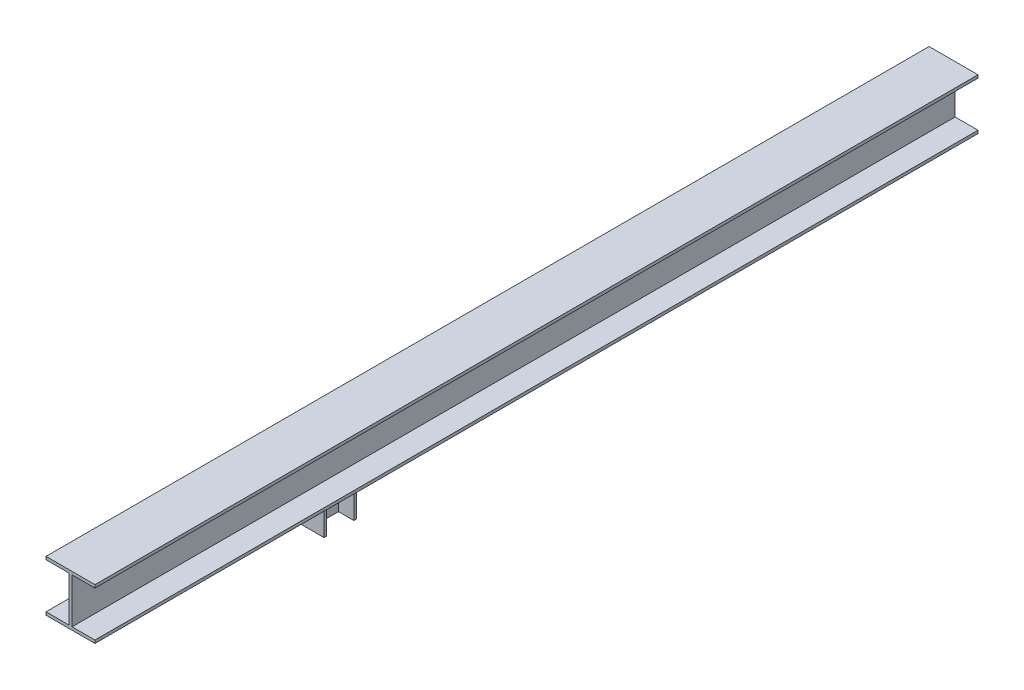
ISO-10303-21;
HEADER;
FILE_DESCRIPTION(('STEP AP214'),'2;1');
FILE_NAME('part.step','',(''),(''),'','','');
FILE_SCHEMA(('AUTOMOTIVE_DESIGN { 1 0 10303 214 1 1 1 1 }'));
ENDSEC;
DATA;
#1=APPLICATION_CONTEXT('core data for automotive mechanical design processes');
#2=APPLICATION_PROTOCOL_DEFINITION('international standard','automotive_design',2000,#1);
#3=PRODUCT_CONTEXT('',#1,'mechanical');
#4=PRODUCT('Part','Part','',(#3));
#5=PRODUCT_RELATED_PRODUCT_CATEGORY('part','',(#4));
#6=PRODUCT_DEFINITION_FORMATION('','',#4);
#7=PRODUCT_DEFINITION_CONTEXT('part definition',#1,'design');
#8=PRODUCT_DEFINITION('design','',#6,#7);
#9=PRODUCT_DEFINITION_SHAPE('','',#8);
#10=(LENGTH_UNIT() NAMED_UNIT(*) SI_UNIT(.MILLI.,.METRE.));
#11=(NAMED_UNIT(*) PLANE_ANGLE_UNIT() SI_UNIT($,.RADIAN.));
#12=(NAMED_UNIT(*) SI_UNIT($,.STERADIAN.) SOLID_ANGLE_UNIT());
#13=UNCERTAINTY_MEASURE_WITH_UNIT(LENGTH_MEASURE(1.E-05),#10,'distance_accuracy_value','');
#14=(GEOMETRIC_REPRESENTATION_CONTEXT(3) GLOBAL_UNCERTAINTY_ASSIGNED_CONTEXT((#13)) GLOBAL_UNIT_ASSIGNED_CONTEXT((#10,
#11,#12)) REPRESENTATION_CONTEXT('',''));
#15=CARTESIAN_POINT('',(0.,0.,0.));
#16=DIRECTION('',(0.,0.,1.));
#17=DIRECTION('',(1.,0.,0.));
#18=AXIS2_PLACEMENT_3D('',#15,#16,#17);
#19=CARTESIAN_POINT('',(95.0070607999999,7.92188859999998,3835.));
#20=DIRECTION('',(-1.,0.,0.));
#21=DIRECTION('',(0.,0.,1.));
#22=AXIS2_PLACEMENT_3D('',#19,#20,#21);
#23=PLANE('',#22);
#24=DIRECTION('',(0.,0.,1.));
#25=VECTOR('',#24,1.);
#26=CARTESIAN_POINT('',(95.0070607999999,203.4218886,3835.));
#27=LINE('',#26,#25);
#28=CARTESIAN_POINT('',(95.0070607999999,203.4218886,3835.));
#29=VERTEX_POINT('',#28);
#30=CARTESIAN_POINT('',(95.0070607999999,203.4218886,4005.));
#31=VERTEX_POINT('',#30);
#32=EDGE_CURVE('E163',#29,#31,#27,.T.);
#33=ORIENTED_EDGE('',*,*,#32,.T.);
#34=DIRECTION('',(0.,1.,0.));
#35=VECTOR('',#34,1.);
#36=CARTESIAN_POINT('',(95.0070607999999,7.92188859999998,4005.));
#37=LINE('',#36,#35);
#38=CARTESIAN_POINT('',(95.0070607999999,7.92188859999998,4005.));
#39=VERTEX_POINT('',#38);
#40=EDGE_CURVE('E12',#39,#31,#37,.T.);
#41=ORIENTED_EDGE('',*,*,#40,.F.);
#42=DIRECTION('',(0.,0.,1.));
#43=VECTOR('',#42,1.);
#44=CARTESIAN_POINT('',(95.0070607999999,7.92188859999998,3835.));
#45=LINE('',#44,#43);
#46=CARTESIAN_POINT('',(95.0070607999999,7.92188859999998,3835.));
#47=VERTEX_POINT('',#46);
#48=EDGE_CURVE('E185',#47,#39,#45,.T.);
#49=ORIENTED_EDGE('',*,*,#48,.F.);
#50=DIRECTION('',(0.,1.,0.));
#51=VECTOR('',#50,1.);
#52=CARTESIAN_POINT('',(95.0070607999999,7.92188859999998,3835.));
#53=LINE('',#52,#51);
#54=EDGE_CURVE('E159',#47,#29,#53,.T.);
#55=ORIENTED_EDGE('',*,*,#54,.T.);
#56=EDGE_LOOP('',(#33,#41,#49,#55));
#57=FACE_BOUND('',#56,.T.);
#58=ADVANCED_FACE('F43',(#57),#23,.F.);
#59=CARTESIAN_POINT('',(95.0070607999999,7.92188859999998,4005.));
#60=DIRECTION('',(0.,0.,1.));
#61=DIRECTION('',(1.,0.,0.));
#62=AXIS2_PLACEMENT_3D('',#59,#60,#61);
#63=PLANE('',#62);
#64=DIRECTION('',(1.,0.,0.));
#65=VECTOR('',#64,1.);
#66=CARTESIAN_POINT('',(95.0070607999999,203.4218886,4005.));
#67=LINE('',#66,#65);
#68=CARTESIAN_POINT('',(190.5070608,203.4218886,4005.));
#69=VERTEX_POINT('',#68);
#70=EDGE_CURVE('E166',#31,#69,#67,.T.);
#71=ORIENTED_EDGE('',*,*,#70,.T.);
#72=DIRECTION('',(0.,1.,0.));
#73=VECTOR('',#72,1.);
#74=CARTESIAN_POINT('',(190.5070608,7.92188859999998,4005.));
#75=LINE('',#74,#73);
#76=CARTESIAN_POINT('',(190.5070608,7.92188859999998,4005.));
#77=VERTEX_POINT('',#76);
#78=EDGE_CURVE('E51',#77,#69,#75,.T.);
#79=ORIENTED_EDGE('',*,*,#78,.F.);
#80=DIRECTION('',(1.,0.,0.));
#81=VECTOR('',#80,1.);
#82=CARTESIAN_POINT('',(95.0070607999999,7.92188859999998,4005.));
#83=LINE('',#82,#81);
#84=EDGE_CURVE('E114',#39,#77,#83,.T.);
#85=ORIENTED_EDGE('',*,*,#84,.F.);
#86=ORIENTED_EDGE('',*,*,#40,.T.);
#87=EDGE_LOOP('',(#71,#79,#85,#86));
#88=FACE_BOUND('',#87,.T.);
#89=ADVANCED_FACE('F263',(#88),#63,.F.);
#90=CARTESIAN_POINT('',(190.5070608,7.92188859999998,4020.));
#91=DIRECTION('',(-1.,0.,0.));
#92=DIRECTION('',(0.,0.,1.));
#93=AXIS2_PLACEMENT_3D('',#90,#91,#92);
#94=PLANE('',#93);
#95=DIRECTION('',(0.,0.,1.));
#96=VECTOR('',#95,1.);
#97=CARTESIAN_POINT('',(190.5070608,203.4218886,4020.));
#98=LINE('',#97,#96);
#99=CARTESIAN_POINT('',(190.5070608,203.4218886,4020.));
#100=VERTEX_POINT('',#99);
#101=EDGE_CURVE('E168',#69,#100,#98,.T.);
#102=ORIENTED_EDGE('',*,*,#101,.T.);
#103=DIRECTION('',(0.,1.,0.));
#104=VECTOR('',#103,1.);
#105=CARTESIAN_POINT('',(190.5070608,7.92188859999998,4020.));
#106=LINE('',#105,#104);
#107=CARTESIAN_POINT('',(190.5070608,7.92188859999998,4020.));
#108=VERTEX_POINT('',#107);
#109=EDGE_CURVE('E204',#108,#100,#106,.T.);
#110=ORIENTED_EDGE('',*,*,#109,.F.);
#111=DIRECTION('',(0.,0.,1.));
#112=VECTOR('',#111,1.);
#113=CARTESIAN_POINT('',(190.5070608,7.92188859999998,4020.));
#114=LINE('',#113,#112);
#115=EDGE_CURVE('E212',#77,#108,#114,.T.);
#116=ORIENTED_EDGE('',*,*,#115,.F.);
#117=ORIENTED_EDGE('',*,*,#78,.T.);
#118=EDGE_LOOP('',(#102,#110,#116,#117));
#119=FACE_BOUND('',#118,.T.);
#120=ADVANCED_FACE('F210',(#119),#94,.F.);
#121=CARTESIAN_POINT('',(-9.49293920000008,7.92188859999998,4020.));
#122=DIRECTION('',(0.,0.,-1.));
#123=DIRECTION('',(-1.,0.,0.));
#124=AXIS2_PLACEMENT_3D('',#121,#122,#123);
#125=PLANE('',#124);
#126=DIRECTION('',(-1.,0.,0.));
#127=VECTOR('',#126,1.);
#128=CARTESIAN_POINT('',(-9.49293920000008,203.4218886,4020.));
#129=LINE('',#128,#127);
#130=CARTESIAN_POINT('',(-9.49293920000008,203.4218886,4020.));
#131=VERTEX_POINT('',#130);
#132=EDGE_CURVE('E170',#100,#131,#129,.T.);
#133=ORIENTED_EDGE('',*,*,#132,.T.);
#134=DIRECTION('',(0.,1.,0.));
#135=VECTOR('',#134,1.);
#136=CARTESIAN_POINT('',(-9.49293920000008,7.92188859999998,4020.));
#137=LINE('',#136,#135);
#138=CARTESIAN_POINT('',(-9.49293920000008,7.92188859999998,4020.));
#139=VERTEX_POINT('',#138);
#140=EDGE_CURVE('E201',#139,#131,#137,.T.);
#141=ORIENTED_EDGE('',*,*,#140,.F.);
#142=DIRECTION('',(-1.,0.,0.));
#143=VECTOR('',#142,1.);
#144=CARTESIAN_POINT('',(-9.49293920000008,7.92188859999998,4020.));
#145=LINE('',#144,#143);
#146=EDGE_CURVE('E230',#108,#139,#145,.T.);
#147=ORIENTED_EDGE('',*,*,#146,.F.);
#148=ORIENTED_EDGE('',*,*,#109,.T.);
#149=EDGE_LOOP('',(#133,#141,#147,#148));
#150=FACE_BOUND('',#149,.T.);
#151=ADVANCED_FACE('F221',(#150),#125,.F.);
#152=CARTESIAN_POINT('',(-9.49293920000008,7.92188859999998,4020.));
#153=DIRECTION('',(1.,0.,0.));
#154=DIRECTION('',(0.,0.,-1.));
#155=AXIS2_PLACEMENT_3D('',#152,#153,#154);
#156=PLANE('',#155);
#157=DIRECTION('',(0.,0.,-1.));
#158=VECTOR('',#157,1.);
#159=CARTESIAN_POINT('',(-9.49293920000008,203.4218886,4020.));
#160=LINE('',#159,#158);
#161=CARTESIAN_POINT('',(-9.49293920000008,203.4218886,4005.));
#162=VERTEX_POINT('',#161);
#163=EDGE_CURVE('E172',#131,#162,#160,.T.);
#164=ORIENTED_EDGE('',*,*,#163,.T.);
#165=DIRECTION('',(0.,1.,0.));
#166=VECTOR('',#165,1.);
#167=CARTESIAN_POINT('',(-9.49293920000008,7.92188859999998,4005.));
#168=LINE('',#167,#166);
#169=CARTESIAN_POINT('',(-9.49293920000008,7.92188859999998,4005.));
#170=VERTEX_POINT('',#169);
#171=EDGE_CURVE('E198',#170,#162,#168,.T.);
#172=ORIENTED_EDGE('',*,*,#171,.F.);
#173=DIRECTION('',(0.,0.,-1.));
#174=VECTOR('',#173,1.);
#175=CARTESIAN_POINT('',(-9.49293920000008,7.92188859999998,4020.));
#176=LINE('',#175,#174);
#177=EDGE_CURVE('E227',#139,#170,#176,.T.);
#178=ORIENTED_EDGE('',*,*,#177,.F.);
#179=ORIENTED_EDGE('',*,*,#140,.T.);
#180=EDGE_LOOP('',(#164,#172,#178,#179));
#181=FACE_BOUND('',#180,.T.);
#182=ADVANCED_FACE('F225',(#181),#156,.F.);
#183=CARTESIAN_POINT('',(-9.49293920000008,7.92188859999998,4005.));
#184=DIRECTION('',(0.,0.,1.));
#185=DIRECTION('',(1.,0.,0.));
#186=AXIS2_PLACEMENT_3D('',#183,#184,#185);
#187=PLANE('',#186);
#188=DIRECTION('',(1.,0.,0.));
#189=VECTOR('',#188,1.);
#190=CARTESIAN_POINT('',(-9.49293920000008,203.4218886,4005.));
#191=LINE('',#190,#189);
#192=CARTESIAN_POINT('',(86.0070608000003,203.4218886,4005.));
#193=VERTEX_POINT('',#192);
#194=EDGE_CURVE('E174',#162,#193,#191,.T.);
#195=ORIENTED_EDGE('',*,*,#194,.T.);
#196=DIRECTION('',(0.,1.,0.));
#197=VECTOR('',#196,1.);
#198=CARTESIAN_POINT('',(86.0070608000003,7.92188859999998,4005.));
#199=LINE('',#198,#197);
#200=CARTESIAN_POINT('',(86.0070608000003,7.92188859999998,4005.));
#201=VERTEX_POINT('',#200);
#202=EDGE_CURVE('E195',#201,#193,#199,.T.);
#203=ORIENTED_EDGE('',*,*,#202,.F.);
#204=DIRECTION('',(1.,0.,0.));
#205=VECTOR('',#204,1.);
#206=CARTESIAN_POINT('',(-9.49293920000008,7.92188859999998,4005.));
#207=LINE('',#206,#205);
#208=EDGE_CURVE('E229',#170,#201,#207,.T.);
#209=ORIENTED_EDGE('',*,*,#208,.F.);
#210=ORIENTED_EDGE('',*,*,#171,.T.);
#211=EDGE_LOOP('',(#195,#203,#209,#210));
#212=FACE_BOUND('',#211,.T.);
#213=ADVANCED_FACE('F276',(#212),#187,.F.);
#214=CARTESIAN_POINT('',(86.0070608000003,7.92188859999998,3835.));
#215=DIRECTION('',(1.,0.,0.));
#216=DIRECTION('',(0.,0.,-1.));
#217=AXIS2_PLACEMENT_3D('',#214,#215,#216);
#218=PLANE('',#217);
#219=DIRECTION('',(0.,0.,-1.));
#220=VECTOR('',#219,1.);
#221=CARTESIAN_POINT('',(86.0070608000003,203.4218886,3835.));
#222=LINE('',#221,#220);
#223=CARTESIAN_POINT('',(86.0070608000003,203.4218886,3835.));
#224=VERTEX_POINT('',#223);
#225=EDGE_CURVE('E176',#193,#224,#222,.T.);
#226=ORIENTED_EDGE('',*,*,#225,.T.);
#227=DIRECTION('',(0.,1.,0.));
#228=VECTOR('',#227,1.);
#229=CARTESIAN_POINT('',(86.0070608000003,7.92188859999998,3835.));
#230=LINE('',#229,#228);
#231=CARTESIAN_POINT('',(86.0070608000003,7.92188859999998,3835.));
#232=VERTEX_POINT('',#231);
#233=EDGE_CURVE('E192',#232,#224,#230,.T.);
#234=ORIENTED_EDGE('',*,*,#233,.F.);
#235=DIRECTION('',(0.,0.,-1.));
#236=VECTOR('',#235,1.);
#237=CARTESIAN_POINT('',(86.0070608000003,7.92188859999998,3835.));
#238=LINE('',#237,#236);
#239=EDGE_CURVE('E232',#201,#232,#238,.T.);
#240=ORIENTED_EDGE('',*,*,#239,.F.);
#241=ORIENTED_EDGE('',*,*,#202,.T.);
#242=EDGE_LOOP('',(#226,#234,#240,#241));
#243=FACE_BOUND('',#242,.T.);
#244=ADVANCED_FACE('F279',(#243),#218,.F.);
#245=CARTESIAN_POINT('',(86.0070608000003,7.92188859999998,3835.));
#246=DIRECTION('',(0.,0.,-1.));
#247=DIRECTION('',(-1.,0.,0.));
#248=AXIS2_PLACEMENT_3D('',#245,#246,#247);
#249=PLANE('',#248);
#250=DIRECTION('',(-1.,0.,0.));
#251=VECTOR('',#250,1.);
#252=CARTESIAN_POINT('',(86.0070608000003,203.4218886,3835.));
#253=LINE('',#252,#251);
#254=CARTESIAN_POINT('',(-9.4929392,203.4218886,3835.));
#255=VERTEX_POINT('',#254);
#256=EDGE_CURVE('E178',#224,#255,#253,.T.);
#257=ORIENTED_EDGE('',*,*,#256,.T.);
#258=DIRECTION('',(0.,1.,0.));
#259=VECTOR('',#258,1.);
#260=CARTESIAN_POINT('',(-9.4929392,7.92188859999998,3835.));
#261=LINE('',#260,#259);
#262=CARTESIAN_POINT('',(-9.4929392,7.92188859999998,3835.));
#263=VERTEX_POINT('',#262);
#264=EDGE_CURVE('E189',#263,#255,#261,.T.);
#265=ORIENTED_EDGE('',*,*,#264,.F.);
#266=DIRECTION('',(-1.,0.,0.));
#267=VECTOR('',#266,1.);
#268=CARTESIAN_POINT('',(86.0070608000003,7.92188859999998,3835.));
#269=LINE('',#268,#267);
#270=EDGE_CURVE('E238',#232,#263,#269,.T.);
#271=ORIENTED_EDGE('',*,*,#270,.F.);
#272=ORIENTED_EDGE('',*,*,#233,.T.);
#273=EDGE_LOOP('',(#257,#265,#271,#272));
#274=FACE_BOUND('',#273,.T.);
#275=ADVANCED_FACE('F244',(#274),#249,.F.);
#276=CARTESIAN_POINT('',(-9.4929392,7.92188859999998,3820.));
#277=DIRECTION('',(1.,0.,0.));
#278=DIRECTION('',(0.,0.,-1.));
#279=AXIS2_PLACEMENT_3D('',#276,#277,#278);
#280=PLANE('',#279);
#281=DIRECTION('',(0.,0.,-1.));
#282=VECTOR('',#281,1.);
#283=CARTESIAN_POINT('',(-9.4929392,203.4218886,3820.));
#284=LINE('',#283,#282);
#285=CARTESIAN_POINT('',(-9.4929392,203.4218886,3820.));
#286=VERTEX_POINT('',#285);
#287=EDGE_CURVE('E180',#255,#286,#284,.T.);
#288=ORIENTED_EDGE('',*,*,#287,.T.);
#289=DIRECTION('',(0.,1.,0.));
#290=VECTOR('',#289,1.);
#291=CARTESIAN_POINT('',(-9.4929392,7.92188859999998,3820.));
#292=LINE('',#291,#290);
#293=CARTESIAN_POINT('',(-9.4929392,7.92188859999998,3820.));
#294=VERTEX_POINT('',#293);
#295=EDGE_CURVE('E154',#294,#286,#292,.T.);
#296=ORIENTED_EDGE('',*,*,#295,.F.);
#297=DIRECTION('',(0.,0.,-1.));
#298=VECTOR('',#297,1.);
#299=CARTESIAN_POINT('',(-9.4929392,7.92188859999998,3820.));
#300=LINE('',#299,#298);
#301=EDGE_CURVE('E145',#263,#294,#300,.T.);
#302=ORIENTED_EDGE('',*,*,#301,.F.);
#303=ORIENTED_EDGE('',*,*,#264,.T.);
#304=EDGE_LOOP('',(#288,#296,#302,#303));
#305=FACE_BOUND('',#304,.T.);
#306=ADVANCED_FACE('F248',(#305),#280,.F.);
#307=CARTESIAN_POINT('',(190.5070608,7.92188859999998,3820.));
#308=DIRECTION('',(0.,0.,1.));
#309=DIRECTION('',(1.,0.,0.));
#310=AXIS2_PLACEMENT_3D('',#307,#308,#309);
#311=PLANE('',#310);
#312=DIRECTION('',(1.,0.,0.));
#313=VECTOR('',#312,1.);
#314=CARTESIAN_POINT('',(190.5070608,203.4218886,3820.));
#315=LINE('',#314,#313);
#316=CARTESIAN_POINT('',(190.5070608,203.4218886,3820.));
#317=VERTEX_POINT('',#316);
#318=EDGE_CURVE('E153',#286,#317,#315,.T.);
#319=ORIENTED_EDGE('',*,*,#318,.T.);
#320=DIRECTION('',(0.,1.,0.));
#321=VECTOR('',#320,1.);
#322=CARTESIAN_POINT('',(190.5070608,7.92188859999998,3820.));
#323=LINE('',#322,#321);
#324=CARTESIAN_POINT('',(190.5070608,7.92188859999998,3820.));
#325=VERTEX_POINT('',#324);
#326=EDGE_CURVE('E150',#325,#317,#323,.T.);
#327=ORIENTED_EDGE('',*,*,#326,.F.);
#328=DIRECTION('',(1.,0.,0.));
#329=VECTOR('',#328,1.);
#330=CARTESIAN_POINT('',(190.5070608,7.92188859999998,3820.));
#331=LINE('',#330,#329);
#332=EDGE_CURVE('E139',#294,#325,#331,.T.);
#333=ORIENTED_EDGE('',*,*,#332,.F.);
#334=ORIENTED_EDGE('',*,*,#295,.T.);
#335=EDGE_LOOP('',(#319,#327,#333,#334));
#336=FACE_BOUND('',#335,.T.);
#337=ADVANCED_FACE('F151',(#336),#311,.F.);
#338=CARTESIAN_POINT('',(190.5070608,7.92188859999998,3820.));
#339=DIRECTION('',(-1.,0.,0.));
#340=DIRECTION('',(0.,0.,1.));
#341=AXIS2_PLACEMENT_3D('',#338,#339,#340);
#342=PLANE('',#341);
#343=DIRECTION('',(0.,0.,1.));
#344=VECTOR('',#343,1.);
#345=CARTESIAN_POINT('',(190.5070608,203.4218886,3820.));
#346=LINE('',#345,#344);
#347=CARTESIAN_POINT('',(190.5070608,203.4218886,3835.));
#348=VERTEX_POINT('',#347);
#349=EDGE_CURVE('E100',#317,#348,#346,.T.);
#350=ORIENTED_EDGE('',*,*,#349,.T.);
#351=DIRECTION('',(0.,1.,0.));
#352=VECTOR('',#351,1.);
#353=CARTESIAN_POINT('',(190.5070608,7.92188859999998,3835.));
#354=LINE('',#353,#352);
#355=CARTESIAN_POINT('',(190.5070608,7.92188859999998,3835.));
#356=VERTEX_POINT('',#355);
#357=EDGE_CURVE('E155',#356,#348,#354,.T.);
#358=ORIENTED_EDGE('',*,*,#357,.F.);
#359=DIRECTION('',(0.,0.,1.));
#360=VECTOR('',#359,1.);
#361=CARTESIAN_POINT('',(190.5070608,7.92188859999998,3820.));
#362=LINE('',#361,#360);
#363=EDGE_CURVE('E143',#325,#356,#362,.T.);
#364=ORIENTED_EDGE('',*,*,#363,.F.);
#365=ORIENTED_EDGE('',*,*,#326,.T.);
#366=EDGE_LOOP('',(#350,#358,#364,#365));
#367=FACE_BOUND('',#366,.T.);
#368=ADVANCED_FACE('F157',(#367),#342,.F.);
#369=CARTESIAN_POINT('',(190.5070608,7.92188859999998,3835.));
#370=DIRECTION('',(0.,0.,-1.));
#371=DIRECTION('',(-1.,0.,0.));
#372=AXIS2_PLACEMENT_3D('',#369,#370,#371);
#373=PLANE('',#372);
#374=DIRECTION('',(-1.,0.,0.));
#375=VECTOR('',#374,1.);
#376=CARTESIAN_POINT('',(190.5070608,203.4218886,3835.));
#377=LINE('',#376,#375);
#378=EDGE_CURVE('E106',#348,#29,#377,.T.);
#379=ORIENTED_EDGE('',*,*,#378,.T.);
#380=ORIENTED_EDGE('',*,*,#54,.F.);
#381=DIRECTION('',(-1.,0.,0.));
#382=VECTOR('',#381,1.);
#383=CARTESIAN_POINT('',(190.5070608,7.92188859999998,3835.));
#384=LINE('',#383,#382);
#385=EDGE_CURVE('E59',#356,#47,#384,.T.);
#386=ORIENTED_EDGE('',*,*,#385,.F.);
#387=ORIENTED_EDGE('',*,*,#357,.T.);
#388=EDGE_LOOP('',(#379,#380,#386,#387));
#389=FACE_BOUND('',#388,.T.);
#390=ADVANCED_FACE('F252',(#389),#373,.F.);
#391=CARTESIAN_POINT('',(95.0070607999999,7.92188859999998,4005.));
#392=DIRECTION('',(0.,1.,0.));
#393=DIRECTION('',(0.,0.,1.));
#394=AXIS2_PLACEMENT_3D('',#391,#392,#393);
#395=PLANE('',#394);
#396=ORIENTED_EDGE('',*,*,#48,.T.);
#397=ORIENTED_EDGE('',*,*,#84,.T.);
#398=ORIENTED_EDGE('',*,*,#115,.T.);
#399=ORIENTED_EDGE('',*,*,#146,.T.);
#400=ORIENTED_EDGE('',*,*,#177,.T.);
#401=ORIENTED_EDGE('',*,*,#208,.T.);
#402=ORIENTED_EDGE('',*,*,#239,.T.);
#403=ORIENTED_EDGE('',*,*,#270,.T.);
#404=ORIENTED_EDGE('',*,*,#301,.T.);
#405=ORIENTED_EDGE('',*,*,#332,.T.);
#406=ORIENTED_EDGE('',*,*,#363,.T.);
#407=ORIENTED_EDGE('',*,*,#385,.T.);
#408=EDGE_LOOP('',(#396,#397,#398,#399,#400,#401,#402,#403,#404,#405,#406,#407));
#409=FACE_BOUND('',#408,.T.);
#410=ADVANCED_FACE('F141',(#409),#395,.F.);
#411=CARTESIAN_POINT('',(95.0070607999999,203.4218886,4005.));
#412=DIRECTION('',(0.,1.,0.));
#413=DIRECTION('',(0.,0.,1.));
#414=AXIS2_PLACEMENT_3D('',#411,#412,#413);
#415=PLANE('',#414);
#416=ORIENTED_EDGE('',*,*,#32,.F.);
#417=ORIENTED_EDGE('',*,*,#378,.F.);
#418=ORIENTED_EDGE('',*,*,#349,.F.);
#419=ORIENTED_EDGE('',*,*,#318,.F.);
#420=ORIENTED_EDGE('',*,*,#287,.F.);
#421=ORIENTED_EDGE('',*,*,#256,.F.);
#422=ORIENTED_EDGE('',*,*,#225,.F.);
#423=ORIENTED_EDGE('',*,*,#194,.F.);
#424=ORIENTED_EDGE('',*,*,#163,.F.);
#425=ORIENTED_EDGE('',*,*,#132,.F.);
#426=ORIENTED_EDGE('',*,*,#101,.F.);
#427=ORIENTED_EDGE('',*,*,#70,.F.);
#428=EDGE_LOOP('',(#416,#417,#418,#419,#420,#421,#422,#423,#424,#425,#426,#427));
#429=FACE_BOUND('',#428,.T.);
#430=ADVANCED_FACE('F216',(#429),#415,.T.);
#431=CLOSED_SHELL('',(#58,#89,#120,#151,#182,#213,#244,#275,#306,#337,#368,#390,#410,#430));
#432=MANIFOLD_SOLID_BREP('B2',#431);
#433=CARTESIAN_POINT('',(80.7570607999933,502.421888569993,5500.));
#434=DIRECTION('',(1.,0.,0.));
#435=DIRECTION('',(0.,1.,0.));
#436=AXIS2_PLACEMENT_3D('',#433,#434,#435);
#437=PLANE('',#436);
#438=DIRECTION('',(0.,-1.,0.));
#439=VECTOR('',#438,1.);
#440=CARTESIAN_POINT('',(80.7570607999933,502.421888569993,0.));
#441=LINE('',#440,#439);
#442=CARTESIAN_POINT('',(80.7570607999933,502.421888569993,0.));
#443=VERTEX_POINT('',#442);
#444=CARTESIAN_POINT('',(80.7570607999933,221.9218886,0.));
#445=VERTEX_POINT('',#444);
#446=EDGE_CURVE('E495',#443,#445,#441,.T.);
#447=ORIENTED_EDGE('',*,*,#446,.T.);
#448=DIRECTION('',(0.,0.,-1.));
#449=VECTOR('',#448,1.);
#450=CARTESIAN_POINT('',(80.7570607999933,221.9218886,5500.));
#451=LINE('',#450,#449);
#452=CARTESIAN_POINT('',(80.7570607999933,221.9218886,5500.));
#453=VERTEX_POINT('',#452);
#454=EDGE_CURVE('E41',#453,#445,#451,.T.);
#455=ORIENTED_EDGE('',*,*,#454,.F.);
#456=DIRECTION('',(0.,-1.,0.));
#457=VECTOR('',#456,1.);
#458=CARTESIAN_POINT('',(80.7570607999933,502.421888569993,5500.));
#459=LINE('',#458,#457);
#460=CARTESIAN_POINT('',(80.7570607999933,502.421888569993,5500.));
#461=VERTEX_POINT('',#460);
#462=EDGE_CURVE('E517',#461,#453,#459,.T.);
#463=ORIENTED_EDGE('',*,*,#462,.F.);
#464=DIRECTION('',(0.,0.,-1.));
#465=VECTOR('',#464,1.);
#466=CARTESIAN_POINT('',(80.7570607999933,502.421888569993,5500.));
#467=LINE('',#466,#465);
#468=EDGE_CURVE('E491',#461,#443,#467,.T.);
#469=ORIENTED_EDGE('',*,*,#468,.T.);
#470=EDGE_LOOP('',(#447,#455,#463,#469));
#471=FACE_BOUND('',#470,.T.);
#472=ADVANCED_FACE('F375',(#471),#437,.F.);
#473=CARTESIAN_POINT('',(80.7570607999933,221.9218886,5500.));
#474=DIRECTION('',(0.,-1.,0.));
#475=DIRECTION('',(0.,0.,-1.));
#476=AXIS2_PLACEMENT_3D('',#473,#474,#475);
#477=PLANE('',#476);
#478=DIRECTION('',(-1.,0.,0.));
#479=VECTOR('',#478,1.);
#480=CARTESIAN_POINT('',(80.7570607999933,221.9218886,0.));
#481=LINE('',#480,#479);
#482=CARTESIAN_POINT('',(-61.8929392,221.9218886,0.));
#483=VERTEX_POINT('',#482);
#484=EDGE_CURVE('E498',#445,#483,#481,.T.);
#485=ORIENTED_EDGE('',*,*,#484,.T.);
#486=DIRECTION('',(0.,0.,-1.));
#487=VECTOR('',#486,1.);
#488=CARTESIAN_POINT('',(-61.8929392,221.9218886,5500.));
#489=LINE('',#488,#487);
#490=CARTESIAN_POINT('',(-61.8929392,221.9218886,5500.));
#491=VERTEX_POINT('',#490);
#492=EDGE_CURVE('E383',#491,#483,#489,.T.);
#493=ORIENTED_EDGE('',*,*,#492,.F.);
#494=DIRECTION('',(-1.,0.,0.));
#495=VECTOR('',#494,1.);
#496=CARTESIAN_POINT('',(80.7570607999933,221.9218886,5500.));
#497=LINE('',#496,#495);
#498=EDGE_CURVE('E446',#453,#491,#497,.T.);
#499=ORIENTED_EDGE('',*,*,#498,.F.);
#500=ORIENTED_EDGE('',*,*,#454,.T.);
#501=EDGE_LOOP('',(#485,#493,#499,#500));
#502=FACE_BOUND('',#501,.T.);
#503=ADVANCED_FACE('F595',(#502),#477,.F.);
#504=CARTESIAN_POINT('',(-61.8929392,221.9218886,5500.));
#505=DIRECTION('',(1.,0.,0.));
#506=DIRECTION('',(0.,0.,-1.));
#507=AXIS2_PLACEMENT_3D('',#504,#505,#506);
#508=PLANE('',#507);
#509=DIRECTION('',(0.,-1.,0.));
#510=VECTOR('',#509,1.);
#511=CARTESIAN_POINT('',(-61.8929392,221.9218886,0.));
#512=LINE('',#511,#510);
#513=CARTESIAN_POINT('',(-61.8929392,203.4218886,0.));
#514=VERTEX_POINT('',#513);
#515=EDGE_CURVE('E500',#483,#514,#512,.T.);
#516=ORIENTED_EDGE('',*,*,#515,.T.);
#517=DIRECTION('',(0.,0.,-1.));
#518=VECTOR('',#517,1.);
#519=CARTESIAN_POINT('',(-61.8929392,203.4218886,5500.));
#520=LINE('',#519,#518);
#521=CARTESIAN_POINT('',(-61.8929392,203.4218886,5500.));
#522=VERTEX_POINT('',#521);
#523=EDGE_CURVE('E536',#522,#514,#520,.T.);
#524=ORIENTED_EDGE('',*,*,#523,.F.);
#525=DIRECTION('',(0.,-1.,0.));
#526=VECTOR('',#525,1.);
#527=CARTESIAN_POINT('',(-61.8929392,221.9218886,5500.));
#528=LINE('',#527,#526);
#529=EDGE_CURVE('E544',#491,#522,#528,.T.);
#530=ORIENTED_EDGE('',*,*,#529,.F.);
#531=ORIENTED_EDGE('',*,*,#492,.T.);
#532=EDGE_LOOP('',(#516,#524,#530,#531));
#533=FACE_BOUND('',#532,.T.);
#534=ADVANCED_FACE('F542',(#533),#508,.F.);
#535=CARTESIAN_POINT('',(-61.8929392,203.4218886,5500.));
#536=DIRECTION('',(0.,1.,0.));
#537=DIRECTION('',(0.,0.,1.));
#538=AXIS2_PLACEMENT_3D('',#535,#536,#537);
#539=PLANE('',#538);
#540=DIRECTION('',(1.,0.,0.));
#541=VECTOR('',#540,1.);
#542=CARTESIAN_POINT('',(-61.8929392,203.4218886,0.));
#543=LINE('',#542,#541);
#544=CARTESIAN_POINT('',(242.9070608,203.4218886,0.));
#545=VERTEX_POINT('',#544);
#546=EDGE_CURVE('E502',#514,#545,#543,.T.);
#547=ORIENTED_EDGE('',*,*,#546,.T.);
#548=DIRECTION('',(0.,0.,-1.));
#549=VECTOR('',#548,1.);
#550=CARTESIAN_POINT('',(242.9070608,203.4218886,5500.));
#551=LINE('',#550,#549);
#552=CARTESIAN_POINT('',(242.9070608,203.4218886,5500.));
#553=VERTEX_POINT('',#552);
#554=EDGE_CURVE('E533',#553,#545,#551,.T.);
#555=ORIENTED_EDGE('',*,*,#554,.F.);
#556=DIRECTION('',(1.,0.,0.));
#557=VECTOR('',#556,1.);
#558=CARTESIAN_POINT('',(-61.8929392,203.4218886,5500.));
#559=LINE('',#558,#557);
#560=EDGE_CURVE('E562',#522,#553,#559,.T.);
#561=ORIENTED_EDGE('',*,*,#560,.F.);
#562=ORIENTED_EDGE('',*,*,#523,.T.);
#563=EDGE_LOOP('',(#547,#555,#561,#562));
#564=FACE_BOUND('',#563,.T.);
#565=ADVANCED_FACE('F553',(#564),#539,.F.);
#566=CARTESIAN_POINT('',(242.9070608,203.4218886,5500.));
#567=DIRECTION('',(-1.,0.,0.));
#568=DIRECTION('',(0.,0.,1.));
#569=AXIS2_PLACEMENT_3D('',#566,#567,#568);
#570=PLANE('',#569);
#571=DIRECTION('',(0.,1.,0.));
#572=VECTOR('',#571,1.);
#573=CARTESIAN_POINT('',(242.9070608,203.4218886,0.));
#574=LINE('',#573,#572);
#575=CARTESIAN_POINT('',(242.9070608,221.9218886,0.));
#576=VERTEX_POINT('',#575);
#577=EDGE_CURVE('E504',#545,#576,#574,.T.);
#578=ORIENTED_EDGE('',*,*,#577,.T.);
#579=DIRECTION('',(0.,0.,-1.));
#580=VECTOR('',#579,1.);
#581=CARTESIAN_POINT('',(242.9070608,221.9218886,5500.));
#582=LINE('',#581,#580);
#583=CARTESIAN_POINT('',(242.9070608,221.9218886,5500.));
#584=VERTEX_POINT('',#583);
#585=EDGE_CURVE('E530',#584,#576,#582,.T.);
#586=ORIENTED_EDGE('',*,*,#585,.F.);
#587=DIRECTION('',(0.,1.,0.));
#588=VECTOR('',#587,1.);
#589=CARTESIAN_POINT('',(242.9070608,203.4218886,5500.));
#590=LINE('',#589,#588);
#591=EDGE_CURVE('E559',#553,#584,#590,.T.);
#592=ORIENTED_EDGE('',*,*,#591,.F.);
#593=ORIENTED_EDGE('',*,*,#554,.T.);
#594=EDGE_LOOP('',(#578,#586,#592,#593));
#595=FACE_BOUND('',#594,.T.);
#596=ADVANCED_FACE('F557',(#595),#570,.F.);
#597=CARTESIAN_POINT('',(242.9070608,221.9218886,5500.));
#598=DIRECTION('',(0.,-1.,0.));
#599=DIRECTION('',(0.,0.,-1.));
#600=AXIS2_PLACEMENT_3D('',#597,#598,#599);
#601=PLANE('',#600);
#602=DIRECTION('',(-1.,0.,0.));
#603=VECTOR('',#602,1.);
#604=CARTESIAN_POINT('',(242.9070608,221.9218886,0.));
#605=LINE('',#604,#603);
#606=CARTESIAN_POINT('',(100.257060830007,221.9218886,0.));
#607=VERTEX_POINT('',#606);
#608=EDGE_CURVE('E506',#576,#607,#605,.T.);
#609=ORIENTED_EDGE('',*,*,#608,.T.);
#610=DIRECTION('',(0.,0.,-1.));
#611=VECTOR('',#610,1.);
#612=CARTESIAN_POINT('',(100.257060830007,221.9218886,5500.));
#613=LINE('',#612,#611);
#614=CARTESIAN_POINT('',(100.257060830007,221.9218886,5500.));
#615=VERTEX_POINT('',#614);
#616=EDGE_CURVE('E527',#615,#607,#613,.T.);
#617=ORIENTED_EDGE('',*,*,#616,.F.);
#618=DIRECTION('',(-1.,0.,0.));
#619=VECTOR('',#618,1.);
#620=CARTESIAN_POINT('',(242.9070608,221.9218886,5500.));
#621=LINE('',#620,#619);
#622=EDGE_CURVE('E561',#584,#615,#621,.T.);
#623=ORIENTED_EDGE('',*,*,#622,.F.);
#624=ORIENTED_EDGE('',*,*,#585,.T.);
#625=EDGE_LOOP('',(#609,#617,#623,#624));
#626=FACE_BOUND('',#625,.T.);
#627=ADVANCED_FACE('F608',(#626),#601,.F.);
#628=CARTESIAN_POINT('',(100.257060830007,221.9218886,5500.));
#629=DIRECTION('',(-1.,0.,0.));
#630=DIRECTION('',(0.,-1.,0.));
#631=AXIS2_PLACEMENT_3D('',#628,#629,#630);
#632=PLANE('',#631);
#633=DIRECTION('',(0.,1.,0.));
#634=VECTOR('',#633,1.);
#635=CARTESIAN_POINT('',(100.257060830007,221.9218886,0.));
#636=LINE('',#635,#634);
#637=CARTESIAN_POINT('',(100.257060830007,502.421888569993,0.));
#638=VERTEX_POINT('',#637);
#639=EDGE_CURVE('E508',#607,#638,#636,.T.);
#640=ORIENTED_EDGE('',*,*,#639,.T.);
#641=DIRECTION('',(0.,0.,-1.));
#642=VECTOR('',#641,1.);
#643=CARTESIAN_POINT('',(100.257060830007,502.421888569993,5500.));
#644=LINE('',#643,#642);
#645=CARTESIAN_POINT('',(100.257060830007,502.421888569993,5500.));
#646=VERTEX_POINT('',#645);
#647=EDGE_CURVE('E524',#646,#638,#644,.T.);
#648=ORIENTED_EDGE('',*,*,#647,.F.);
#649=DIRECTION('',(0.,1.,0.));
#650=VECTOR('',#649,1.);
#651=CARTESIAN_POINT('',(100.257060830007,221.9218886,5500.));
#652=LINE('',#651,#650);
#653=EDGE_CURVE('E564',#615,#646,#652,.T.);
#654=ORIENTED_EDGE('',*,*,#653,.F.);
#655=ORIENTED_EDGE('',*,*,#616,.T.);
#656=EDGE_LOOP('',(#640,#648,#654,#655));
#657=FACE_BOUND('',#656,.T.);
#658=ADVANCED_FACE('F611',(#657),#632,.F.);
#659=CARTESIAN_POINT('',(100.257060830007,502.421888569993,5500.));
#660=DIRECTION('',(0.,1.,0.));
#661=DIRECTION('',(0.,0.,1.));
#662=AXIS2_PLACEMENT_3D('',#659,#660,#661);
#663=PLANE('',#662);
#664=DIRECTION('',(1.,0.,0.));
#665=VECTOR('',#664,1.);
#666=CARTESIAN_POINT('',(100.257060830007,502.421888569993,0.));
#667=LINE('',#666,#665);
#668=CARTESIAN_POINT('',(242.907060834999,502.421888569993,0.));
#669=VERTEX_POINT('',#668);
#670=EDGE_CURVE('E510',#638,#669,#667,.T.);
#671=ORIENTED_EDGE('',*,*,#670,.T.);
#672=DIRECTION('',(0.,0.,-1.));
#673=VECTOR('',#672,1.);
#674=CARTESIAN_POINT('',(242.907060834999,502.421888569993,5500.));
#675=LINE('',#674,#673);
#676=CARTESIAN_POINT('',(242.907060834999,502.421888569993,5500.));
#677=VERTEX_POINT('',#676);
#678=EDGE_CURVE('E521',#677,#669,#675,.T.);
#679=ORIENTED_EDGE('',*,*,#678,.F.);
#680=DIRECTION('',(1.,0.,0.));
#681=VECTOR('',#680,1.);
#682=CARTESIAN_POINT('',(100.257060830007,502.421888569993,5500.));
#683=LINE('',#682,#681);
#684=EDGE_CURVE('E570',#646,#677,#683,.T.);
#685=ORIENTED_EDGE('',*,*,#684,.F.);
#686=ORIENTED_EDGE('',*,*,#647,.T.);
#687=EDGE_LOOP('',(#671,#679,#685,#686));
#688=FACE_BOUND('',#687,.T.);
#689=ADVANCED_FACE('F576',(#688),#663,.F.);
#690=CARTESIAN_POINT('',(242.907060834999,502.421888569993,5500.));
#691=DIRECTION('',(-1.,0.,0.));
#692=DIRECTION('',(0.,0.,1.));
#693=AXIS2_PLACEMENT_3D('',#690,#691,#692);
#694=PLANE('',#693);
#695=DIRECTION('',(0.,1.,0.));
#696=VECTOR('',#695,1.);
#697=CARTESIAN_POINT('',(242.907060834999,502.421888569993,0.));
#698=LINE('',#697,#696);
#699=CARTESIAN_POINT('',(242.907060834999,520.921888569993,0.));
#700=VERTEX_POINT('',#699);
#701=EDGE_CURVE('E512',#669,#700,#698,.T.);
#702=ORIENTED_EDGE('',*,*,#701,.T.);
#703=DIRECTION('',(0.,0.,-1.));
#704=VECTOR('',#703,1.);
#705=CARTESIAN_POINT('',(242.907060834999,520.921888569993,5500.));
#706=LINE('',#705,#704);
#707=CARTESIAN_POINT('',(242.907060834999,520.921888569993,5500.));
#708=VERTEX_POINT('',#707);
#709=EDGE_CURVE('E486',#708,#700,#706,.T.);
#710=ORIENTED_EDGE('',*,*,#709,.F.);
#711=DIRECTION('',(0.,1.,0.));
#712=VECTOR('',#711,1.);
#713=CARTESIAN_POINT('',(242.907060834999,502.421888569993,5500.));
#714=LINE('',#713,#712);
#715=EDGE_CURVE('E477',#677,#708,#714,.T.);
#716=ORIENTED_EDGE('',*,*,#715,.F.);
#717=ORIENTED_EDGE('',*,*,#678,.T.);
#718=EDGE_LOOP('',(#702,#710,#716,#717));
#719=FACE_BOUND('',#718,.T.);
#720=ADVANCED_FACE('F580',(#719),#694,.F.);
#721=CARTESIAN_POINT('',(242.907060834999,520.921888569993,5500.));
#722=DIRECTION('',(0.,-1.,0.));
#723=DIRECTION('',(0.,0.,-1.));
#724=AXIS2_PLACEMENT_3D('',#721,#722,#723);
#725=PLANE('',#724);
#726=DIRECTION('',(-1.,0.,0.));
#727=VECTOR('',#726,1.);
#728=CARTESIAN_POINT('',(242.907060834999,520.921888569993,0.));
#729=LINE('',#728,#727);
#730=CARTESIAN_POINT('',(-61.8929392,520.921888569993,0.));
#731=VERTEX_POINT('',#730);
#732=EDGE_CURVE('E485',#700,#731,#729,.T.);
#733=ORIENTED_EDGE('',*,*,#732,.T.);
#734=DIRECTION('',(0.,0.,-1.));
#735=VECTOR('',#734,1.);
#736=CARTESIAN_POINT('',(-61.8929392,520.921888569993,5500.));
#737=LINE('',#736,#735);
#738=CARTESIAN_POINT('',(-61.8929392,520.921888569993,5500.));
#739=VERTEX_POINT('',#738);
#740=EDGE_CURVE('E482',#739,#731,#737,.T.);
#741=ORIENTED_EDGE('',*,*,#740,.F.);
#742=DIRECTION('',(-1.,0.,0.));
#743=VECTOR('',#742,1.);
#744=CARTESIAN_POINT('',(242.907060834999,520.921888569993,5500.));
#745=LINE('',#744,#743);
#746=EDGE_CURVE('E471',#708,#739,#745,.T.);
#747=ORIENTED_EDGE('',*,*,#746,.F.);
#748=ORIENTED_EDGE('',*,*,#709,.T.);
#749=EDGE_LOOP('',(#733,#741,#747,#748));
#750=FACE_BOUND('',#749,.T.);
#751=ADVANCED_FACE('F483',(#750),#725,.F.);
#752=CARTESIAN_POINT('',(-61.8929392,520.921888569993,5500.));
#753=DIRECTION('',(1.,0.,0.));
#754=DIRECTION('',(0.,0.,-1.));
#755=AXIS2_PLACEMENT_3D('',#752,#753,#754);
#756=PLANE('',#755);
#757=DIRECTION('',(0.,-1.,0.));
#758=VECTOR('',#757,1.);
#759=CARTESIAN_POINT('',(-61.8929392,520.921888569993,0.));
#760=LINE('',#759,#758);
#761=CARTESIAN_POINT('',(-61.8929392,502.421888569993,0.));
#762=VERTEX_POINT('',#761);
#763=EDGE_CURVE('E432',#731,#762,#760,.T.);
#764=ORIENTED_EDGE('',*,*,#763,.T.);
#765=DIRECTION('',(0.,0.,-1.));
#766=VECTOR('',#765,1.);
#767=CARTESIAN_POINT('',(-61.8929392,502.421888569993,5500.));
#768=LINE('',#767,#766);
#769=CARTESIAN_POINT('',(-61.8929392,502.421888569993,5500.));
#770=VERTEX_POINT('',#769);
#771=EDGE_CURVE('E487',#770,#762,#768,.T.);
#772=ORIENTED_EDGE('',*,*,#771,.F.);
#773=DIRECTION('',(0.,-1.,0.));
#774=VECTOR('',#773,1.);
#775=CARTESIAN_POINT('',(-61.8929392,520.921888569993,5500.));
#776=LINE('',#775,#774);
#777=EDGE_CURVE('E475',#739,#770,#776,.T.);
#778=ORIENTED_EDGE('',*,*,#777,.F.);
#779=ORIENTED_EDGE('',*,*,#740,.T.);
#780=EDGE_LOOP('',(#764,#772,#778,#779));
#781=FACE_BOUND('',#780,.T.);
#782=ADVANCED_FACE('F489',(#781),#756,.F.);
#783=CARTESIAN_POINT('',(-61.8929392,502.421888569993,5500.));
#784=DIRECTION('',(0.,1.,0.));
#785=DIRECTION('',(0.,0.,1.));
#786=AXIS2_PLACEMENT_3D('',#783,#784,#785);
#787=PLANE('',#786);
#788=DIRECTION('',(1.,0.,0.));
#789=VECTOR('',#788,1.);
#790=CARTESIAN_POINT('',(-61.8929392,502.421888569993,0.));
#791=LINE('',#790,#789);
#792=EDGE_CURVE('E438',#762,#443,#791,.T.);
#793=ORIENTED_EDGE('',*,*,#792,.T.);
#794=ORIENTED_EDGE('',*,*,#468,.F.);
#795=DIRECTION('',(1.,0.,0.));
#796=VECTOR('',#795,1.);
#797=CARTESIAN_POINT('',(-61.8929392,502.421888569993,5500.));
#798=LINE('',#797,#796);
#799=EDGE_CURVE('E391',#770,#461,#798,.T.);
#800=ORIENTED_EDGE('',*,*,#799,.F.);
#801=ORIENTED_EDGE('',*,*,#771,.T.);
#802=EDGE_LOOP('',(#793,#794,#800,#801));
#803=FACE_BOUND('',#802,.T.);
#804=ADVANCED_FACE('F584',(#803),#787,.F.);
#805=CARTESIAN_POINT('',(80.7570607999933,221.9218886,5500.));
#806=DIRECTION('',(0.,0.,-1.));
#807=DIRECTION('',(-1.,0.,0.));
#808=AXIS2_PLACEMENT_3D('',#805,#806,#807);
#809=PLANE('',#808);
#810=ORIENTED_EDGE('',*,*,#462,.T.);
#811=ORIENTED_EDGE('',*,*,#498,.T.);
#812=ORIENTED_EDGE('',*,*,#529,.T.);
#813=ORIENTED_EDGE('',*,*,#560,.T.);
#814=ORIENTED_EDGE('',*,*,#591,.T.);
#815=ORIENTED_EDGE('',*,*,#622,.T.);
#816=ORIENTED_EDGE('',*,*,#653,.T.);
#817=ORIENTED_EDGE('',*,*,#684,.T.);
#818=ORIENTED_EDGE('',*,*,#715,.T.);
#819=ORIENTED_EDGE('',*,*,#746,.T.);
#820=ORIENTED_EDGE('',*,*,#777,.T.);
#821=ORIENTED_EDGE('',*,*,#799,.T.);
#822=EDGE_LOOP('',(#810,#811,#812,#813,#814,#815,#816,#817,#818,#819,#820,#821));
#823=FACE_BOUND('',#822,.T.);
#824=ADVANCED_FACE('F473',(#823),#809,.F.);
#825=CARTESIAN_POINT('',(80.7570607999933,221.9218886,0.));
#826=DIRECTION('',(0.,0.,-1.));
#827=DIRECTION('',(-1.,0.,0.));
#828=AXIS2_PLACEMENT_3D('',#825,#826,#827);
#829=PLANE('',#828);
#830=ORIENTED_EDGE('',*,*,#446,.F.);
#831=ORIENTED_EDGE('',*,*,#792,.F.);
#832=ORIENTED_EDGE('',*,*,#763,.F.);
#833=ORIENTED_EDGE('',*,*,#732,.F.);
#834=ORIENTED_EDGE('',*,*,#701,.F.);
#835=ORIENTED_EDGE('',*,*,#670,.F.);
#836=ORIENTED_EDGE('',*,*,#639,.F.);
#837=ORIENTED_EDGE('',*,*,#608,.F.);
#838=ORIENTED_EDGE('',*,*,#577,.F.);
#839=ORIENTED_EDGE('',*,*,#546,.F.);
#840=ORIENTED_EDGE('',*,*,#515,.F.);
#841=ORIENTED_EDGE('',*,*,#484,.F.);
#842=EDGE_LOOP('',(#830,#831,#832,#833,#834,#835,#836,#837,#838,#839,#840,#841));
#843=FACE_BOUND('',#842,.T.);
#844=ADVANCED_FACE('F548',(#843),#829,.T.);
#845=CLOSED_SHELL('',(#472,#503,#534,#565,#596,#627,#658,#689,#720,#751,#782,#804,#824,#844));
#846=MANIFOLD_SOLID_BREP('B6',#845);
#847=ADVANCED_BREP_SHAPE_REPRESENTATION('',(#18,#432,#846),#14);
#848=SHAPE_DEFINITION_REPRESENTATION(#9,#847);
ENDSEC;
END-ISO-10303-21;
